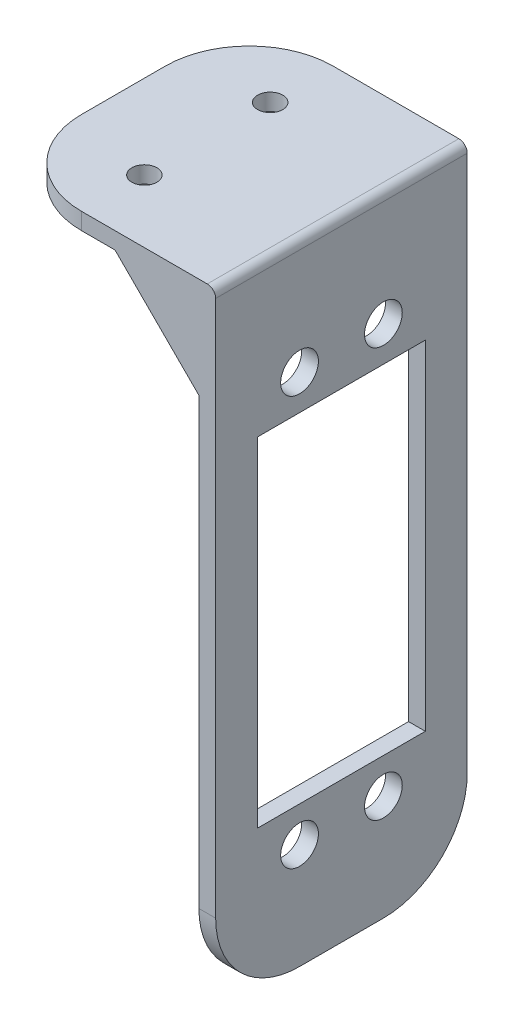
ISO-10303-21;
HEADER;
FILE_DESCRIPTION(('STEP AP214'),'2;1');
FILE_NAME('part.step','',(''),(''),'','','');
FILE_SCHEMA(('AUTOMOTIVE_DESIGN { 1 0 10303 214 1 1 1 1 }'));
ENDSEC;
DATA;
#1=APPLICATION_CONTEXT('core data for automotive mechanical design processes');
#2=APPLICATION_PROTOCOL_DEFINITION('international standard','automotive_design',2000,#1);
#3=PRODUCT_CONTEXT('',#1,'mechanical');
#4=PRODUCT('Part','Part','',(#3));
#5=PRODUCT_RELATED_PRODUCT_CATEGORY('part','',(#4));
#6=PRODUCT_DEFINITION_FORMATION('','',#4);
#7=PRODUCT_DEFINITION_CONTEXT('part definition',#1,'design');
#8=PRODUCT_DEFINITION('design','',#6,#7);
#9=PRODUCT_DEFINITION_SHAPE('','',#8);
#10=(LENGTH_UNIT() NAMED_UNIT(*) SI_UNIT(.MILLI.,.METRE.));
#11=(NAMED_UNIT(*) PLANE_ANGLE_UNIT() SI_UNIT($,.RADIAN.));
#12=(NAMED_UNIT(*) SI_UNIT($,.STERADIAN.) SOLID_ANGLE_UNIT());
#13=UNCERTAINTY_MEASURE_WITH_UNIT(LENGTH_MEASURE(1.E-05),#10,'distance_accuracy_value','');
#14=(GEOMETRIC_REPRESENTATION_CONTEXT(3) GLOBAL_UNCERTAINTY_ASSIGNED_CONTEXT((#13)) GLOBAL_UNIT_ASSIGNED_CONTEXT((#10,
#11,#12)) REPRESENTATION_CONTEXT('',''));
#15=CARTESIAN_POINT('',(0.,0.,0.));
#16=DIRECTION('',(0.,0.,1.));
#17=DIRECTION('',(1.,0.,0.));
#18=AXIS2_PLACEMENT_3D('',#15,#16,#17);
#19=CARTESIAN_POINT('',(23.,-1.,-30.));
#20=DIRECTION('',(0.,0.,1.));
#21=DIRECTION('',(1.,0.,0.));
#22=AXIS2_PLACEMENT_3D('',#19,#20,#21);
#23=CYLINDRICAL_SURFACE('',#22,1.);
#24=CARTESIAN_POINT('',(23.,-1.,-28.));
#25=DIRECTION('',(0.,0.,1.));
#26=DIRECTION('',(1.,0.,0.));
#27=AXIS2_PLACEMENT_3D('',#24,#25,#26);
#28=CIRCLE('',#27,1.);
#29=CARTESIAN_POINT('',(24.,-1.,-28.));
#30=VERTEX_POINT('',#29);
#31=CARTESIAN_POINT('',(23.,0.,-28.));
#32=VERTEX_POINT('',#31);
#33=EDGE_CURVE('E345',#30,#32,#28,.T.);
#34=ORIENTED_EDGE('',*,*,#33,.F.);
#35=DIRECTION('',(0.,0.,-1.));
#36=VECTOR('',#35,1.);
#37=CARTESIAN_POINT('',(24.,-1.,-30.));
#38=LINE('',#37,#36);
#39=CARTESIAN_POINT('',(24.,-1.,-2.));
#40=VERTEX_POINT('',#39);
#41=EDGE_CURVE('E351',#40,#30,#38,.T.);
#42=ORIENTED_EDGE('',*,*,#41,.F.);
#43=CARTESIAN_POINT('',(23.,-1.,-2.));
#44=DIRECTION('',(0.,0.,1.));
#45=DIRECTION('',(1.,0.,0.));
#46=AXIS2_PLACEMENT_3D('',#43,#44,#45);
#47=CIRCLE('',#46,1.);
#48=CARTESIAN_POINT('',(23.,0.,-2.));
#49=VERTEX_POINT('',#48);
#50=EDGE_CURVE('E361',#40,#49,#47,.T.);
#51=ORIENTED_EDGE('',*,*,#50,.T.);
#52=DIRECTION('',(0.,0.,-1.));
#53=VECTOR('',#52,1.);
#54=CARTESIAN_POINT('',(23.,0.,0.));
#55=LINE('',#54,#53);
#56=EDGE_CURVE('E474',#32,#49,#55,.F.);
#57=ORIENTED_EDGE('',*,*,#56,.F.);
#58=EDGE_LOOP('',(#34,#42,#51,#57));
#59=FACE_BOUND('',#58,.T.);
#60=ADVANCED_FACE('F191',(#59),#23,.F.);
#61=CARTESIAN_POINT('',(24.,-73.,-30.));
#62=DIRECTION('',(-1.,0.,0.));
#63=DIRECTION('',(0.,0.,1.));
#64=AXIS2_PLACEMENT_3D('',#61,#62,#63);
#65=PLANE('',#64);
#66=DIRECTION('',(0.,-1.,0.));
#67=VECTOR('',#66,1.);
#68=CARTESIAN_POINT('',(24.,0.,-25.));
#69=LINE('',#68,#67);
#70=CARTESIAN_POINT('',(24.,-15.8,-25.));
#71=VERTEX_POINT('',#70);
#72=CARTESIAN_POINT('',(24.,-56.2,-25.));
#73=VERTEX_POINT('',#72);
#74=EDGE_CURVE('E383',#71,#73,#69,.T.);
#75=ORIENTED_EDGE('',*,*,#74,.F.);
#76=DIRECTION('',(0.,0.,1.));
#77=VECTOR('',#76,1.);
#78=CARTESIAN_POINT('',(24.,-15.8,0.));
#79=LINE('',#78,#77);
#80=CARTESIAN_POINT('',(24.,-15.8,-5.));
#81=VERTEX_POINT('',#80);
#82=EDGE_CURVE('E380',#71,#81,#79,.T.);
#83=ORIENTED_EDGE('',*,*,#82,.T.);
#84=DIRECTION('',(0.,-1.,0.));
#85=VECTOR('',#84,1.);
#86=CARTESIAN_POINT('',(24.,0.,-5.));
#87=LINE('',#86,#85);
#88=CARTESIAN_POINT('',(24.,-56.2,-4.99999999999999));
#89=VERTEX_POINT('',#88);
#90=EDGE_CURVE('E375',#81,#89,#87,.T.);
#91=ORIENTED_EDGE('',*,*,#90,.T.);
#92=DIRECTION('',(0.,0.,-1.));
#93=VECTOR('',#92,1.);
#94=CARTESIAN_POINT('',(24.,-56.2,0.));
#95=LINE('',#94,#93);
#96=EDGE_CURVE('E386',#89,#73,#95,.T.);
#97=ORIENTED_EDGE('',*,*,#96,.T.);
#98=EDGE_LOOP('',(#75,#83,#91,#97));
#99=FACE_BOUND('',#98,.T.);
#100=CARTESIAN_POINT('',(24.,-60.4,-10.));
#101=DIRECTION('',(-1.,0.,0.));
#102=DIRECTION('',(0.,0.,1.));
#103=AXIS2_PLACEMENT_3D('',#100,#101,#102);
#104=CIRCLE('',#103,2.25);
#105=CARTESIAN_POINT('',(24.,-60.4,-7.75));
#106=VERTEX_POINT('',#105);
#107=EDGE_CURVE('E403',#106,#106,#104,.T.);
#108=ORIENTED_EDGE('',*,*,#107,.F.);
#109=EDGE_LOOP('',(#108));
#110=FACE_BOUND('',#109,.T.);
#111=CARTESIAN_POINT('',(24.,-11.6,-10.));
#112=DIRECTION('',(-1.,0.,0.));
#113=DIRECTION('',(0.,0.,1.));
#114=AXIS2_PLACEMENT_3D('',#111,#112,#113);
#115=CIRCLE('',#114,2.25000000000002);
#116=CARTESIAN_POINT('',(24.,-11.6,-7.74999999999999));
#117=VERTEX_POINT('',#116);
#118=EDGE_CURVE('E402',#117,#117,#115,.T.);
#119=ORIENTED_EDGE('',*,*,#118,.F.);
#120=EDGE_LOOP('',(#119));
#121=FACE_BOUND('',#120,.T.);
#122=CARTESIAN_POINT('',(24.,-11.6,-20.));
#123=DIRECTION('',(-1.,0.,0.));
#124=DIRECTION('',(0.,0.,1.));
#125=AXIS2_PLACEMENT_3D('',#122,#123,#124);
#126=CIRCLE('',#125,2.25);
#127=CARTESIAN_POINT('',(24.,-11.6,-17.75));
#128=VERTEX_POINT('',#127);
#129=EDGE_CURVE('E392',#128,#128,#126,.T.);
#130=ORIENTED_EDGE('',*,*,#129,.F.);
#131=EDGE_LOOP('',(#130));
#132=FACE_BOUND('',#131,.T.);
#133=CARTESIAN_POINT('',(24.,-60.4,-20.));
#134=DIRECTION('',(-1.,0.,0.));
#135=DIRECTION('',(0.,0.,1.));
#136=AXIS2_PLACEMENT_3D('',#133,#134,#135);
#137=CIRCLE('',#136,2.25);
#138=CARTESIAN_POINT('',(24.,-60.4,-17.75));
#139=VERTEX_POINT('',#138);
#140=EDGE_CURVE('E406',#139,#139,#137,.T.);
#141=ORIENTED_EDGE('',*,*,#140,.F.);
#142=EDGE_LOOP('',(#141));
#143=FACE_BOUND('',#142,.T.);
#144=DIRECTION('',(0.,-1.,0.));
#145=VECTOR('',#144,1.);
#146=CARTESIAN_POINT('',(24.,0.,-28.));
#147=LINE('',#146,#145);
#148=CARTESIAN_POINT('',(24.,-10.,-28.));
#149=VERTEX_POINT('',#148);
#150=EDGE_CURVE('E332',#30,#149,#147,.T.);
#151=ORIENTED_EDGE('',*,*,#150,.T.);
#152=DIRECTION('',(0.,0.,-1.));
#153=VECTOR('',#152,1.);
#154=CARTESIAN_POINT('',(24.,-10.,-28.));
#155=LINE('',#154,#153);
#156=CARTESIAN_POINT('',(24.,-10.,-30.));
#157=VERTEX_POINT('',#156);
#158=EDGE_CURVE('E340',#149,#157,#155,.T.);
#159=ORIENTED_EDGE('',*,*,#158,.T.);
#160=DIRECTION('',(0.,1.,0.));
#161=VECTOR('',#160,1.);
#162=CARTESIAN_POINT('',(24.,-73.,-30.));
#163=LINE('',#162,#161);
#164=CARTESIAN_POINT('',(24.,-63.,-30.));
#165=VERTEX_POINT('',#164);
#166=EDGE_CURVE('E438',#165,#157,#163,.T.);
#167=ORIENTED_EDGE('',*,*,#166,.F.);
#168=CARTESIAN_POINT('',(24.,-63.,-20.));
#169=DIRECTION('',(-1.,0.,0.));
#170=DIRECTION('',(0.,0.,1.));
#171=AXIS2_PLACEMENT_3D('',#168,#169,#170);
#172=CIRCLE('',#171,10.);
#173=CARTESIAN_POINT('',(24.,-73.,-20.));
#174=VERTEX_POINT('',#173);
#175=EDGE_CURVE('E495',#165,#174,#172,.T.);
#176=ORIENTED_EDGE('',*,*,#175,.T.);
#177=DIRECTION('',(0.,0.,1.));
#178=VECTOR('',#177,1.);
#179=CARTESIAN_POINT('',(24.,-73.,-30.));
#180=LINE('',#179,#178);
#181=CARTESIAN_POINT('',(24.,-73.,-10.));
#182=VERTEX_POINT('',#181);
#183=EDGE_CURVE('E432',#174,#182,#180,.T.);
#184=ORIENTED_EDGE('',*,*,#183,.T.);
#185=CARTESIAN_POINT('',(24.,-63.,-10.));
#186=DIRECTION('',(-1.,0.,0.));
#187=DIRECTION('',(0.,0.,1.));
#188=AXIS2_PLACEMENT_3D('',#185,#186,#187);
#189=CIRCLE('',#188,10.);
#190=CARTESIAN_POINT('',(24.,-63.,0.));
#191=VERTEX_POINT('',#190);
#192=EDGE_CURVE('E493',#182,#191,#189,.T.);
#193=ORIENTED_EDGE('',*,*,#192,.T.);
#194=DIRECTION('',(0.,1.,0.));
#195=VECTOR('',#194,1.);
#196=CARTESIAN_POINT('',(24.,-73.,0.));
#197=LINE('',#196,#195);
#198=CARTESIAN_POINT('',(24.,-10.,0.));
#199=VERTEX_POINT('',#198);
#200=EDGE_CURVE('E444',#191,#199,#197,.T.);
#201=ORIENTED_EDGE('',*,*,#200,.T.);
#202=DIRECTION('',(0.,0.,1.));
#203=VECTOR('',#202,1.);
#204=CARTESIAN_POINT('',(24.,-10.,-2.));
#205=LINE('',#204,#203);
#206=CARTESIAN_POINT('',(24.,-10.,-2.));
#207=VERTEX_POINT('',#206);
#208=EDGE_CURVE('E373',#207,#199,#205,.T.);
#209=ORIENTED_EDGE('',*,*,#208,.F.);
#210=DIRECTION('',(0.,-1.,0.));
#211=VECTOR('',#210,1.);
#212=CARTESIAN_POINT('',(24.,0.,-2.));
#213=LINE('',#212,#211);
#214=EDGE_CURVE('E359',#40,#207,#213,.T.);
#215=ORIENTED_EDGE('',*,*,#214,.F.);
#216=ORIENTED_EDGE('',*,*,#41,.T.);
#217=EDGE_LOOP('',(#151,#159,#167,#176,#184,#193,#201,#209,#215,#216));
#218=FACE_BOUND('',#217,.T.);
#219=ADVANCED_FACE('F348',(#99,#110,#121,#132,#143,#218),#65,.T.);
#220=CARTESIAN_POINT('',(0.,0.,0.));
#221=DIRECTION('',(0.,-1.,0.));
#222=DIRECTION('',(0.,0.,-1.));
#223=AXIS2_PLACEMENT_3D('',#220,#221,#222);
#224=PLANE('',#223);
#225=CARTESIAN_POINT('',(10.,0.,-7.5));
#226=DIRECTION('',(0.,1.,0.));
#227=DIRECTION('',(0.,0.,1.));
#228=AXIS2_PLACEMENT_3D('',#225,#226,#227);
#229=CIRCLE('',#228,1.5);
#230=CARTESIAN_POINT('',(10.,0.,-6.));
#231=VERTEX_POINT('',#230);
#232=EDGE_CURVE('E451',#231,#231,#229,.T.);
#233=ORIENTED_EDGE('',*,*,#232,.T.);
#234=EDGE_LOOP('',(#233));
#235=FACE_BOUND('',#234,.T.);
#236=CARTESIAN_POINT('',(10.,0.,-22.5));
#237=DIRECTION('',(0.,1.,0.));
#238=DIRECTION('',(0.,0.,1.));
#239=AXIS2_PLACEMENT_3D('',#236,#237,#238);
#240=CIRCLE('',#239,1.5);
#241=CARTESIAN_POINT('',(10.,0.,-21.));
#242=VERTEX_POINT('',#241);
#243=EDGE_CURVE('E441',#242,#242,#240,.T.);
#244=ORIENTED_EDGE('',*,*,#243,.T.);
#245=EDGE_LOOP('',(#244));
#246=FACE_BOUND('',#245,.T.);
#247=DIRECTION('',(-1.,0.,0.));
#248=VECTOR('',#247,1.);
#249=CARTESIAN_POINT('',(0.,0.,-30.));
#250=LINE('',#249,#248);
#251=CARTESIAN_POINT('',(14.,0.,-30.));
#252=VERTEX_POINT('',#251);
#253=CARTESIAN_POINT('',(10.,0.,-30.));
#254=VERTEX_POINT('',#253);
#255=EDGE_CURVE('E463',#252,#254,#250,.T.);
#256=ORIENTED_EDGE('',*,*,#255,.F.);
#257=DIRECTION('',(0.,0.,-1.));
#258=VECTOR('',#257,1.);
#259=CARTESIAN_POINT('',(14.,0.,-28.));
#260=LINE('',#259,#258);
#261=CARTESIAN_POINT('',(14.,0.,-28.));
#262=VERTEX_POINT('',#261);
#263=EDGE_CURVE('E344',#262,#252,#260,.T.);
#264=ORIENTED_EDGE('',*,*,#263,.F.);
#265=DIRECTION('',(1.,0.,0.));
#266=VECTOR('',#265,1.);
#267=CARTESIAN_POINT('',(0.,0.,-28.));
#268=LINE('',#267,#266);
#269=EDGE_CURVE('E335',#262,#32,#268,.T.);
#270=ORIENTED_EDGE('',*,*,#269,.T.);
#271=ORIENTED_EDGE('',*,*,#56,.T.);
#272=DIRECTION('',(1.,0.,0.));
#273=VECTOR('',#272,1.);
#274=CARTESIAN_POINT('',(0.,0.,-2.));
#275=LINE('',#274,#273);
#276=CARTESIAN_POINT('',(14.,0.,-2.));
#277=VERTEX_POINT('',#276);
#278=EDGE_CURVE('E364',#277,#49,#275,.T.);
#279=ORIENTED_EDGE('',*,*,#278,.F.);
#280=DIRECTION('',(0.,0.,1.));
#281=VECTOR('',#280,1.);
#282=CARTESIAN_POINT('',(14.,0.,-2.));
#283=LINE('',#282,#281);
#284=CARTESIAN_POINT('',(14.,0.,0.));
#285=VERTEX_POINT('',#284);
#286=EDGE_CURVE('E370',#277,#285,#283,.T.);
#287=ORIENTED_EDGE('',*,*,#286,.T.);
#288=DIRECTION('',(1.,0.,0.));
#289=VECTOR('',#288,1.);
#290=CARTESIAN_POINT('',(0.,0.,0.));
#291=LINE('',#290,#289);
#292=CARTESIAN_POINT('',(10.,0.,0.));
#293=VERTEX_POINT('',#292);
#294=EDGE_CURVE('E469',#293,#285,#291,.T.);
#295=ORIENTED_EDGE('',*,*,#294,.F.);
#296=CARTESIAN_POINT('',(10.,0.,-10.));
#297=DIRECTION('',(0.,-1.,0.));
#298=DIRECTION('',(0.,0.,-1.));
#299=AXIS2_PLACEMENT_3D('',#296,#297,#298);
#300=CIRCLE('',#299,10.);
#301=CARTESIAN_POINT('',(0.,0.,-10.));
#302=VERTEX_POINT('',#301);
#303=EDGE_CURVE('E514',#293,#302,#300,.T.);
#304=ORIENTED_EDGE('',*,*,#303,.T.);
#305=DIRECTION('',(0.,0.,1.));
#306=VECTOR('',#305,1.);
#307=CARTESIAN_POINT('',(0.,0.,0.));
#308=LINE('',#307,#306);
#309=CARTESIAN_POINT('',(0.,0.,-20.));
#310=VERTEX_POINT('',#309);
#311=EDGE_CURVE('E457',#310,#302,#308,.T.);
#312=ORIENTED_EDGE('',*,*,#311,.F.);
#313=CARTESIAN_POINT('',(10.,0.,-20.));
#314=DIRECTION('',(0.,-1.,0.));
#315=DIRECTION('',(0.,0.,-1.));
#316=AXIS2_PLACEMENT_3D('',#313,#314,#315);
#317=CIRCLE('',#316,10.);
#318=EDGE_CURVE('E511',#310,#254,#317,.T.);
#319=ORIENTED_EDGE('',*,*,#318,.T.);
#320=EDGE_LOOP('',(#256,#264,#270,#271,#279,#287,#295,#304,#312,#319));
#321=FACE_BOUND('',#320,.T.);
#322=ADVANCED_FACE('F532',(#235,#246,#321),#224,.T.);
#323=CARTESIAN_POINT('',(26.,-73.,-30.));
#324=DIRECTION('',(1.,0.,0.));
#325=DIRECTION('',(0.,0.,-1.));
#326=AXIS2_PLACEMENT_3D('',#323,#324,#325);
#327=PLANE('',#326);
#328=DIRECTION('',(0.,1.,0.));
#329=VECTOR('',#328,1.);
#330=CARTESIAN_POINT('',(26.,-73.,-25.));
#331=LINE('',#330,#329);
#332=CARTESIAN_POINT('',(26.,-56.2,-25.));
#333=VERTEX_POINT('',#332);
#334=CARTESIAN_POINT('',(26.,-15.8,-25.));
#335=VERTEX_POINT('',#334);
#336=EDGE_CURVE('E424',#333,#335,#331,.T.);
#337=ORIENTED_EDGE('',*,*,#336,.F.);
#338=DIRECTION('',(0.,0.,-1.));
#339=VECTOR('',#338,1.);
#340=CARTESIAN_POINT('',(26.,-56.2,-30.));
#341=LINE('',#340,#339);
#342=CARTESIAN_POINT('',(26.,-56.2,-4.99999999999999));
#343=VERTEX_POINT('',#342);
#344=EDGE_CURVE('E417',#343,#333,#341,.T.);
#345=ORIENTED_EDGE('',*,*,#344,.F.);
#346=DIRECTION('',(0.,1.,0.));
#347=VECTOR('',#346,1.);
#348=CARTESIAN_POINT('',(26.,-73.,-4.99999999999999));
#349=LINE('',#348,#347);
#350=CARTESIAN_POINT('',(26.,-15.8,-5.));
#351=VERTEX_POINT('',#350);
#352=EDGE_CURVE('E419',#343,#351,#349,.T.);
#353=ORIENTED_EDGE('',*,*,#352,.T.);
#354=DIRECTION('',(0.,0.,1.));
#355=VECTOR('',#354,1.);
#356=CARTESIAN_POINT('',(26.,-15.8,-30.));
#357=LINE('',#356,#355);
#358=EDGE_CURVE('E422',#335,#351,#357,.T.);
#359=ORIENTED_EDGE('',*,*,#358,.F.);
#360=EDGE_LOOP('',(#337,#345,#353,#359));
#361=FACE_BOUND('',#360,.T.);
#362=CARTESIAN_POINT('',(26.,-60.4,-10.));
#363=DIRECTION('',(1.,0.,0.));
#364=DIRECTION('',(0.,0.,-1.));
#365=AXIS2_PLACEMENT_3D('',#362,#363,#364);
#366=CIRCLE('',#365,2.25);
#367=CARTESIAN_POINT('',(26.,-60.4,-12.25));
#368=VERTEX_POINT('',#367);
#369=EDGE_CURVE('E429',#368,#368,#366,.T.);
#370=ORIENTED_EDGE('',*,*,#369,.F.);
#371=EDGE_LOOP('',(#370));
#372=FACE_BOUND('',#371,.T.);
#373=CARTESIAN_POINT('',(26.,-11.6,-10.));
#374=DIRECTION('',(1.,0.,0.));
#375=DIRECTION('',(0.,0.,-1.));
#376=AXIS2_PLACEMENT_3D('',#373,#374,#375);
#377=CIRCLE('',#376,2.25000000000002);
#378=CARTESIAN_POINT('',(26.,-11.6,-12.25));
#379=VERTEX_POINT('',#378);
#380=EDGE_CURVE('E426',#379,#379,#377,.T.);
#381=ORIENTED_EDGE('',*,*,#380,.F.);
#382=EDGE_LOOP('',(#381));
#383=FACE_BOUND('',#382,.T.);
#384=CARTESIAN_POINT('',(26.,-11.6,-20.));
#385=DIRECTION('',(1.,0.,0.));
#386=DIRECTION('',(0.,0.,-1.));
#387=AXIS2_PLACEMENT_3D('',#384,#385,#386);
#388=CIRCLE('',#387,2.25);
#389=CARTESIAN_POINT('',(26.,-11.6,-22.25));
#390=VERTEX_POINT('',#389);
#391=EDGE_CURVE('E414',#390,#390,#388,.T.);
#392=ORIENTED_EDGE('',*,*,#391,.F.);
#393=EDGE_LOOP('',(#392));
#394=FACE_BOUND('',#393,.T.);
#395=CARTESIAN_POINT('',(26.,-60.4,-20.));
#396=DIRECTION('',(1.,0.,0.));
#397=DIRECTION('',(0.,0.,-1.));
#398=AXIS2_PLACEMENT_3D('',#395,#396,#397);
#399=CIRCLE('',#398,2.25);
#400=CARTESIAN_POINT('',(26.,-60.4,-22.25));
#401=VERTEX_POINT('',#400);
#402=EDGE_CURVE('E411',#401,#401,#399,.T.);
#403=ORIENTED_EDGE('',*,*,#402,.F.);
#404=EDGE_LOOP('',(#403));
#405=FACE_BOUND('',#404,.T.);
#406=DIRECTION('',(0.,0.,-1.));
#407=VECTOR('',#406,1.);
#408=CARTESIAN_POINT('',(26.,-73.,-30.));
#409=LINE('',#408,#407);
#410=CARTESIAN_POINT('',(26.,-73.,-10.));
#411=VERTEX_POINT('',#410);
#412=CARTESIAN_POINT('',(26.,-73.,-20.));
#413=VERTEX_POINT('',#412);
#414=EDGE_CURVE('E435',#411,#413,#409,.T.);
#415=ORIENTED_EDGE('',*,*,#414,.T.);
#416=CARTESIAN_POINT('',(26.,-63.,-20.));
#417=DIRECTION('',(1.,0.,0.));
#418=DIRECTION('',(0.,0.,-1.));
#419=AXIS2_PLACEMENT_3D('',#416,#417,#418);
#420=CIRCLE('',#419,10.);
#421=CARTESIAN_POINT('',(26.,-63.,-30.));
#422=VERTEX_POINT('',#421);
#423=EDGE_CURVE('E503',#413,#422,#420,.T.);
#424=ORIENTED_EDGE('',*,*,#423,.T.);
#425=DIRECTION('',(0.,1.,0.));
#426=VECTOR('',#425,1.);
#427=CARTESIAN_POINT('',(26.,-73.,-30.));
#428=LINE('',#427,#426);
#429=CARTESIAN_POINT('',(26.,1.,-30.));
#430=VERTEX_POINT('',#429);
#431=EDGE_CURVE('E439',#422,#430,#428,.T.);
#432=ORIENTED_EDGE('',*,*,#431,.T.);
#433=DIRECTION('',(0.,0.,-1.));
#434=VECTOR('',#433,1.);
#435=CARTESIAN_POINT('',(26.,1.,0.));
#436=LINE('',#435,#434);
#437=CARTESIAN_POINT('',(26.,1.,0.));
#438=VERTEX_POINT('',#437);
#439=EDGE_CURVE('E482',#430,#438,#436,.F.);
#440=ORIENTED_EDGE('',*,*,#439,.T.);
#441=DIRECTION('',(0.,1.,0.));
#442=VECTOR('',#441,1.);
#443=CARTESIAN_POINT('',(26.,-73.,0.));
#444=LINE('',#443,#442);
#445=CARTESIAN_POINT('',(26.,-63.,0.));
#446=VERTEX_POINT('',#445);
#447=EDGE_CURVE('E442',#446,#438,#444,.T.);
#448=ORIENTED_EDGE('',*,*,#447,.F.);
#449=CARTESIAN_POINT('',(26.,-63.,-10.));
#450=DIRECTION('',(1.,0.,0.));
#451=DIRECTION('',(0.,0.,-1.));
#452=AXIS2_PLACEMENT_3D('',#449,#450,#451);
#453=CIRCLE('',#452,10.);
#454=EDGE_CURVE('E501',#446,#411,#453,.T.);
#455=ORIENTED_EDGE('',*,*,#454,.T.);
#456=EDGE_LOOP('',(#415,#424,#432,#440,#448,#455));
#457=FACE_BOUND('',#456,.T.);
#458=ADVANCED_FACE('F550',(#361,#372,#383,#394,#405,#457),#327,.T.);
#459=CARTESIAN_POINT('',(0.,2.,0.));
#460=DIRECTION('',(0.,-1.,0.));
#461=DIRECTION('',(0.,0.,-1.));
#462=AXIS2_PLACEMENT_3D('',#459,#460,#461);
#463=PLANE('',#462);
#464=DIRECTION('',(0.,0.,1.));
#465=VECTOR('',#464,1.);
#466=CARTESIAN_POINT('',(0.,2.,0.));
#467=LINE('',#466,#465);
#468=CARTESIAN_POINT('',(0.,2.,-20.));
#469=VERTEX_POINT('',#468);
#470=CARTESIAN_POINT('',(0.,2.,-10.));
#471=VERTEX_POINT('',#470);
#472=EDGE_CURVE('E460',#469,#471,#467,.T.);
#473=ORIENTED_EDGE('',*,*,#472,.T.);
#474=CARTESIAN_POINT('',(10.,2.,-10.));
#475=DIRECTION('',(0.,-1.,0.));
#476=DIRECTION('',(0.,0.,-1.));
#477=AXIS2_PLACEMENT_3D('',#474,#475,#476);
#478=CIRCLE('',#477,10.);
#479=CARTESIAN_POINT('',(10.,2.,0.));
#480=VERTEX_POINT('',#479);
#481=EDGE_CURVE('E12',#471,#480,#478,.F.);
#482=ORIENTED_EDGE('',*,*,#481,.T.);
#483=DIRECTION('',(1.,0.,0.));
#484=VECTOR('',#483,1.);
#485=CARTESIAN_POINT('',(0.,2.,0.));
#486=LINE('',#485,#484);
#487=CARTESIAN_POINT('',(25.,2.,0.));
#488=VERTEX_POINT('',#487);
#489=EDGE_CURVE('E462',#480,#488,#486,.T.);
#490=ORIENTED_EDGE('',*,*,#489,.T.);
#491=DIRECTION('',(0.,0.,-1.));
#492=VECTOR('',#491,1.);
#493=CARTESIAN_POINT('',(25.,2.,-30.));
#494=LINE('',#493,#492);
#495=CARTESIAN_POINT('',(25.,2.,-30.));
#496=VERTEX_POINT('',#495);
#497=EDGE_CURVE('E476',#488,#496,#494,.T.);
#498=ORIENTED_EDGE('',*,*,#497,.T.);
#499=DIRECTION('',(-1.,0.,0.));
#500=VECTOR('',#499,1.);
#501=CARTESIAN_POINT('',(0.,2.,-30.));
#502=LINE('',#501,#500);
#503=CARTESIAN_POINT('',(10.,2.,-30.));
#504=VERTEX_POINT('',#503);
#505=EDGE_CURVE('E465',#496,#504,#502,.T.);
#506=ORIENTED_EDGE('',*,*,#505,.T.);
#507=CARTESIAN_POINT('',(10.,2.,-20.));
#508=DIRECTION('',(0.,-1.,0.));
#509=DIRECTION('',(0.,0.,-1.));
#510=AXIS2_PLACEMENT_3D('',#507,#508,#509);
#511=CIRCLE('',#510,10.);
#512=EDGE_CURVE('E199',#504,#469,#511,.F.);
#513=ORIENTED_EDGE('',*,*,#512,.T.);
#514=EDGE_LOOP('',(#473,#482,#490,#498,#506,#513));
#515=FACE_BOUND('',#514,.T.);
#516=CARTESIAN_POINT('',(10.,2.,-7.5));
#517=DIRECTION('',(0.,1.,0.));
#518=DIRECTION('',(0.,0.,1.));
#519=AXIS2_PLACEMENT_3D('',#516,#517,#518);
#520=CIRCLE('',#519,1.5);
#521=CARTESIAN_POINT('',(10.,2.,-6.));
#522=VERTEX_POINT('',#521);
#523=EDGE_CURVE('E454',#522,#522,#520,.T.);
#524=ORIENTED_EDGE('',*,*,#523,.F.);
#525=EDGE_LOOP('',(#524));
#526=FACE_BOUND('',#525,.T.);
#527=CARTESIAN_POINT('',(10.,2.,-22.5));
#528=DIRECTION('',(0.,1.,0.));
#529=DIRECTION('',(0.,0.,1.));
#530=AXIS2_PLACEMENT_3D('',#527,#528,#529);
#531=CIRCLE('',#530,1.5);
#532=CARTESIAN_POINT('',(10.,2.,-21.));
#533=VERTEX_POINT('',#532);
#534=EDGE_CURVE('E448',#533,#533,#531,.T.);
#535=ORIENTED_EDGE('',*,*,#534,.F.);
#536=EDGE_LOOP('',(#535));
#537=FACE_BOUND('',#536,.T.);
#538=ADVANCED_FACE('F521',(#515,#526,#537),#463,.F.);
#539=CARTESIAN_POINT('',(0.,2.,0.));
#540=DIRECTION('',(1.,0.,0.));
#541=DIRECTION('',(0.,0.,-1.));
#542=AXIS2_PLACEMENT_3D('',#539,#540,#541);
#543=PLANE('',#542);
#544=ORIENTED_EDGE('',*,*,#311,.T.);
#545=DIRECTION('',(0.,-1.,0.));
#546=VECTOR('',#545,1.);
#547=CARTESIAN_POINT('',(0.,2.,-10.));
#548=LINE('',#547,#546);
#549=EDGE_CURVE('E214',#302,#471,#548,.F.);
#550=ORIENTED_EDGE('',*,*,#549,.T.);
#551=ORIENTED_EDGE('',*,*,#472,.F.);
#552=DIRECTION('',(0.,-1.,0.));
#553=VECTOR('',#552,1.);
#554=CARTESIAN_POINT('',(0.,2.,-20.));
#555=LINE('',#554,#553);
#556=EDGE_CURVE('E516',#469,#310,#555,.T.);
#557=ORIENTED_EDGE('',*,*,#556,.T.);
#558=EDGE_LOOP('',(#544,#550,#551,#557));
#559=FACE_BOUND('',#558,.T.);
#560=ADVANCED_FACE('F528',(#559),#543,.F.);
#561=CARTESIAN_POINT('',(0.,2.,0.));
#562=DIRECTION('',(0.,0.,-1.));
#563=DIRECTION('',(-1.,0.,0.));
#564=AXIS2_PLACEMENT_3D('',#561,#562,#563);
#565=PLANE('',#564);
#566=DIRECTION('',(0.707106781186548,-0.707106781186548,0.));
#567=VECTOR('',#566,1.);
#568=CARTESIAN_POINT('',(7.,7.,0.));
#569=LINE('',#568,#567);
#570=EDGE_CURVE('E357',#285,#199,#569,.T.);
#571=ORIENTED_EDGE('',*,*,#570,.T.);
#572=ORIENTED_EDGE('',*,*,#200,.F.);
#573=DIRECTION('',(1.,0.,0.));
#574=VECTOR('',#573,1.);
#575=CARTESIAN_POINT('',(26.,-63.,0.));
#576=LINE('',#575,#574);
#577=EDGE_CURVE('E508',#191,#446,#576,.T.);
#578=ORIENTED_EDGE('',*,*,#577,.T.);
#579=ORIENTED_EDGE('',*,*,#447,.T.);
#580=CARTESIAN_POINT('',(25.,1.,0.));
#581=DIRECTION('',(0.,0.,-1.));
#582=DIRECTION('',(-1.,0.,0.));
#583=AXIS2_PLACEMENT_3D('',#580,#581,#582);
#584=CIRCLE('',#583,1.);
#585=EDGE_CURVE('E485',#438,#488,#584,.F.);
#586=ORIENTED_EDGE('',*,*,#585,.T.);
#587=ORIENTED_EDGE('',*,*,#489,.F.);
#588=DIRECTION('',(0.,-1.,0.));
#589=VECTOR('',#588,1.);
#590=CARTESIAN_POINT('',(10.,2.,0.));
#591=LINE('',#590,#589);
#592=EDGE_CURVE('E505',#480,#293,#591,.T.);
#593=ORIENTED_EDGE('',*,*,#592,.T.);
#594=ORIENTED_EDGE('',*,*,#294,.T.);
#595=EDGE_LOOP('',(#571,#572,#578,#579,#586,#587,#593,#594));
#596=FACE_BOUND('',#595,.T.);
#597=ADVANCED_FACE('F539',(#596),#565,.F.);
#598=CARTESIAN_POINT('',(0.,2.,-30.));
#599=DIRECTION('',(0.,0.,1.));
#600=DIRECTION('',(1.,0.,0.));
#601=AXIS2_PLACEMENT_3D('',#598,#599,#600);
#602=PLANE('',#601);
#603=ORIENTED_EDGE('',*,*,#166,.T.);
#604=DIRECTION('',(0.707106781186548,-0.707106781186548,0.));
#605=VECTOR('',#604,1.);
#606=CARTESIAN_POINT('',(7.,7.,-30.));
#607=LINE('',#606,#605);
#608=EDGE_CURVE('E206',#252,#157,#607,.T.);
#609=ORIENTED_EDGE('',*,*,#608,.F.);
#610=ORIENTED_EDGE('',*,*,#255,.T.);
#611=DIRECTION('',(0.,-1.,0.));
#612=VECTOR('',#611,1.);
#613=CARTESIAN_POINT('',(10.,2.,-30.));
#614=LINE('',#613,#612);
#615=EDGE_CURVE('E488',#254,#504,#614,.F.);
#616=ORIENTED_EDGE('',*,*,#615,.T.);
#617=ORIENTED_EDGE('',*,*,#505,.F.);
#618=CARTESIAN_POINT('',(25.,1.,-30.));
#619=DIRECTION('',(0.,0.,1.));
#620=DIRECTION('',(1.,0.,0.));
#621=AXIS2_PLACEMENT_3D('',#618,#619,#620);
#622=CIRCLE('',#621,1.);
#623=EDGE_CURVE('E479',#496,#430,#622,.F.);
#624=ORIENTED_EDGE('',*,*,#623,.T.);
#625=ORIENTED_EDGE('',*,*,#431,.F.);
#626=DIRECTION('',(-1.,0.,0.));
#627=VECTOR('',#626,1.);
#628=CARTESIAN_POINT('',(24.,-63.,-30.));
#629=LINE('',#628,#627);
#630=EDGE_CURVE('E490',#422,#165,#629,.T.);
#631=ORIENTED_EDGE('',*,*,#630,.T.);
#632=EDGE_LOOP('',(#603,#609,#610,#616,#617,#624,#625,#631));
#633=FACE_BOUND('',#632,.T.);
#634=ADVANCED_FACE('F546',(#633),#602,.F.);
#635=CARTESIAN_POINT('',(10.,2.,-7.5));
#636=DIRECTION('',(0.,-1.,0.));
#637=DIRECTION('',(0.,0.,-1.));
#638=AXIS2_PLACEMENT_3D('',#635,#636,#637);
#639=CYLINDRICAL_SURFACE('',#638,1.5);
#640=ORIENTED_EDGE('',*,*,#523,.T.);
#641=EDGE_LOOP('',(#640));
#642=FACE_BOUND('',#641,.T.);
#643=ORIENTED_EDGE('',*,*,#232,.F.);
#644=EDGE_LOOP('',(#643));
#645=FACE_BOUND('',#644,.T.);
#646=ADVANCED_FACE('F646',(#642,#645),#639,.F.);
#647=CARTESIAN_POINT('',(10.,2.,-22.5));
#648=DIRECTION('',(0.,-1.,0.));
#649=DIRECTION('',(0.,0.,-1.));
#650=AXIS2_PLACEMENT_3D('',#647,#648,#649);
#651=CYLINDRICAL_SURFACE('',#650,1.5);
#652=ORIENTED_EDGE('',*,*,#534,.T.);
#653=EDGE_LOOP('',(#652));
#654=FACE_BOUND('',#653,.T.);
#655=ORIENTED_EDGE('',*,*,#243,.F.);
#656=EDGE_LOOP('',(#655));
#657=FACE_BOUND('',#656,.T.);
#658=ADVANCED_FACE('F640',(#654,#657),#651,.F.);
#659=CARTESIAN_POINT('',(0.,-73.,0.));
#660=DIRECTION('',(0.,-1.,0.));
#661=DIRECTION('',(0.,0.,-1.));
#662=AXIS2_PLACEMENT_3D('',#659,#660,#661);
#663=PLANE('',#662);
#664=ORIENTED_EDGE('',*,*,#183,.F.);
#665=DIRECTION('',(-1.,0.,0.));
#666=VECTOR('',#665,1.);
#667=CARTESIAN_POINT('',(26.,-73.,-20.));
#668=LINE('',#667,#666);
#669=EDGE_CURVE('E499',#174,#413,#668,.F.);
#670=ORIENTED_EDGE('',*,*,#669,.T.);
#671=ORIENTED_EDGE('',*,*,#414,.F.);
#672=DIRECTION('',(1.,0.,0.));
#673=VECTOR('',#672,1.);
#674=CARTESIAN_POINT('',(24.,-73.,-10.));
#675=LINE('',#674,#673);
#676=EDGE_CURVE('E497',#411,#182,#675,.F.);
#677=ORIENTED_EDGE('',*,*,#676,.T.);
#678=EDGE_LOOP('',(#664,#670,#671,#677));
#679=FACE_BOUND('',#678,.T.);
#680=ADVANCED_FACE('F559',(#679),#663,.T.);
#681=CARTESIAN_POINT('',(25.,1.,0.));
#682=DIRECTION('',(0.,0.,1.));
#683=DIRECTION('',(1.,0.,0.));
#684=AXIS2_PLACEMENT_3D('',#681,#682,#683);
#685=CYLINDRICAL_SURFACE('',#684,1.);
#686=ORIENTED_EDGE('',*,*,#585,.F.);
#687=ORIENTED_EDGE('',*,*,#439,.F.);
#688=ORIENTED_EDGE('',*,*,#623,.F.);
#689=ORIENTED_EDGE('',*,*,#497,.F.);
#690=EDGE_LOOP('',(#686,#687,#688,#689));
#691=FACE_BOUND('',#690,.T.);
#692=ADVANCED_FACE('F545',(#691),#685,.T.);
#693=CARTESIAN_POINT('',(99.,-60.4,-20.));
#694=DIRECTION('',(-1.,0.,0.));
#695=DIRECTION('',(0.,0.,1.));
#696=AXIS2_PLACEMENT_3D('',#693,#694,#695);
#697=CYLINDRICAL_SURFACE('',#696,2.25);
#698=ORIENTED_EDGE('',*,*,#402,.T.);
#699=EDGE_LOOP('',(#698));
#700=FACE_BOUND('',#699,.T.);
#701=ORIENTED_EDGE('',*,*,#140,.T.);
#702=EDGE_LOOP('',(#701));
#703=FACE_BOUND('',#702,.T.);
#704=ADVANCED_FACE('F587',(#700,#703),#697,.F.);
#705=CARTESIAN_POINT('',(99.,-11.6,-20.));
#706=DIRECTION('',(-1.,0.,0.));
#707=DIRECTION('',(0.,0.,1.));
#708=AXIS2_PLACEMENT_3D('',#705,#706,#707);
#709=CYLINDRICAL_SURFACE('',#708,2.25);
#710=ORIENTED_EDGE('',*,*,#391,.T.);
#711=EDGE_LOOP('',(#710));
#712=FACE_BOUND('',#711,.T.);
#713=ORIENTED_EDGE('',*,*,#129,.T.);
#714=EDGE_LOOP('',(#713));
#715=FACE_BOUND('',#714,.T.);
#716=ADVANCED_FACE('F612',(#712,#715),#709,.F.);
#717=CARTESIAN_POINT('',(99.,-56.2,0.));
#718=DIRECTION('',(0.,1.,0.));
#719=DIRECTION('',(0.,0.,1.));
#720=AXIS2_PLACEMENT_3D('',#717,#718,#719);
#721=PLANE('',#720);
#722=DIRECTION('',(-1.,0.,0.));
#723=VECTOR('',#722,1.);
#724=CARTESIAN_POINT('',(99.,-56.2,-25.));
#725=LINE('',#724,#723);
#726=EDGE_CURVE('E390',#333,#73,#725,.T.);
#727=ORIENTED_EDGE('',*,*,#726,.T.);
#728=ORIENTED_EDGE('',*,*,#96,.F.);
#729=DIRECTION('',(-1.,0.,0.));
#730=VECTOR('',#729,1.);
#731=CARTESIAN_POINT('',(99.,-56.2,-5.));
#732=LINE('',#731,#730);
#733=EDGE_CURVE('E389',#343,#89,#732,.T.);
#734=ORIENTED_EDGE('',*,*,#733,.F.);
#735=ORIENTED_EDGE('',*,*,#344,.T.);
#736=EDGE_LOOP('',(#727,#728,#734,#735));
#737=FACE_BOUND('',#736,.T.);
#738=ADVANCED_FACE('F608',(#737),#721,.T.);
#739=CARTESIAN_POINT('',(99.,0.,-25.));
#740=DIRECTION('',(0.,0.,-1.));
#741=DIRECTION('',(0.,1.,0.));
#742=AXIS2_PLACEMENT_3D('',#739,#740,#741);
#743=PLANE('',#742);
#744=ORIENTED_EDGE('',*,*,#336,.T.);
#745=DIRECTION('',(-1.,0.,0.));
#746=VECTOR('',#745,1.);
#747=CARTESIAN_POINT('',(99.,-15.8,-25.));
#748=LINE('',#747,#746);
#749=EDGE_CURVE('E393',#335,#71,#748,.T.);
#750=ORIENTED_EDGE('',*,*,#749,.T.);
#751=ORIENTED_EDGE('',*,*,#74,.T.);
#752=ORIENTED_EDGE('',*,*,#726,.F.);
#753=EDGE_LOOP('',(#744,#750,#751,#752));
#754=FACE_BOUND('',#753,.T.);
#755=ADVANCED_FACE('F611',(#754),#743,.F.);
#756=CARTESIAN_POINT('',(99.,-15.8,0.));
#757=DIRECTION('',(0.,1.,0.));
#758=DIRECTION('',(0.,0.,1.));
#759=AXIS2_PLACEMENT_3D('',#756,#757,#758);
#760=PLANE('',#759);
#761=ORIENTED_EDGE('',*,*,#358,.T.);
#762=DIRECTION('',(-1.,0.,0.));
#763=VECTOR('',#762,1.);
#764=CARTESIAN_POINT('',(99.,-15.8,-5.00000000000001));
#765=LINE('',#764,#763);
#766=EDGE_CURVE('E396',#351,#81,#765,.T.);
#767=ORIENTED_EDGE('',*,*,#766,.T.);
#768=ORIENTED_EDGE('',*,*,#82,.F.);
#769=ORIENTED_EDGE('',*,*,#749,.F.);
#770=EDGE_LOOP('',(#761,#767,#768,#769));
#771=FACE_BOUND('',#770,.T.);
#772=ADVANCED_FACE('F616',(#771),#760,.F.);
#773=CARTESIAN_POINT('',(99.,0.,-5.00000000000001));
#774=DIRECTION('',(0.,0.,-1.));
#775=DIRECTION('',(0.,1.,0.));
#776=AXIS2_PLACEMENT_3D('',#773,#774,#775);
#777=PLANE('',#776);
#778=ORIENTED_EDGE('',*,*,#733,.T.);
#779=ORIENTED_EDGE('',*,*,#90,.F.);
#780=ORIENTED_EDGE('',*,*,#766,.F.);
#781=ORIENTED_EDGE('',*,*,#352,.F.);
#782=EDGE_LOOP('',(#778,#779,#780,#781));
#783=FACE_BOUND('',#782,.T.);
#784=ADVANCED_FACE('F620',(#783),#777,.T.);
#785=CARTESIAN_POINT('',(99.,-11.6,-10.));
#786=DIRECTION('',(-1.,0.,0.));
#787=DIRECTION('',(0.,0.,1.));
#788=AXIS2_PLACEMENT_3D('',#785,#786,#787);
#789=CYLINDRICAL_SURFACE('',#788,2.25000000000002);
#790=ORIENTED_EDGE('',*,*,#380,.T.);
#791=EDGE_LOOP('',(#790));
#792=FACE_BOUND('',#791,.T.);
#793=ORIENTED_EDGE('',*,*,#118,.T.);
#794=EDGE_LOOP('',(#793));
#795=FACE_BOUND('',#794,.T.);
#796=ADVANCED_FACE('F624',(#792,#795),#789,.F.);
#797=CARTESIAN_POINT('',(99.,-60.4,-10.));
#798=DIRECTION('',(-1.,0.,0.));
#799=DIRECTION('',(0.,0.,1.));
#800=AXIS2_PLACEMENT_3D('',#797,#798,#799);
#801=CYLINDRICAL_SURFACE('',#800,2.25);
#802=ORIENTED_EDGE('',*,*,#369,.T.);
#803=EDGE_LOOP('',(#802));
#804=FACE_BOUND('',#803,.T.);
#805=ORIENTED_EDGE('',*,*,#107,.T.);
#806=EDGE_LOOP('',(#805));
#807=FACE_BOUND('',#806,.T.);
#808=ADVANCED_FACE('F590',(#804,#807),#801,.F.);
#809=CARTESIAN_POINT('',(0.,-63.,-20.));
#810=DIRECTION('',(1.,0.,0.));
#811=DIRECTION('',(0.,0.,-1.));
#812=AXIS2_PLACEMENT_3D('',#809,#810,#811);
#813=CYLINDRICAL_SURFACE('',#812,10.);
#814=ORIENTED_EDGE('',*,*,#423,.F.);
#815=ORIENTED_EDGE('',*,*,#669,.F.);
#816=ORIENTED_EDGE('',*,*,#175,.F.);
#817=ORIENTED_EDGE('',*,*,#630,.F.);
#818=EDGE_LOOP('',(#814,#815,#816,#817));
#819=FACE_BOUND('',#818,.T.);
#820=ADVANCED_FACE('F555',(#819),#813,.T.);
#821=CARTESIAN_POINT('',(0.,-63.,-10.));
#822=DIRECTION('',(-1.,0.,0.));
#823=DIRECTION('',(0.,0.,1.));
#824=AXIS2_PLACEMENT_3D('',#821,#822,#823);
#825=CYLINDRICAL_SURFACE('',#824,10.);
#826=ORIENTED_EDGE('',*,*,#192,.F.);
#827=ORIENTED_EDGE('',*,*,#676,.F.);
#828=ORIENTED_EDGE('',*,*,#454,.F.);
#829=ORIENTED_EDGE('',*,*,#577,.F.);
#830=EDGE_LOOP('',(#826,#827,#828,#829));
#831=FACE_BOUND('',#830,.T.);
#832=ADVANCED_FACE('F562',(#831),#825,.T.);
#833=CARTESIAN_POINT('',(10.,2.,-10.));
#834=DIRECTION('',(0.,-1.,0.));
#835=DIRECTION('',(0.,0.,-1.));
#836=AXIS2_PLACEMENT_3D('',#833,#834,#835);
#837=CYLINDRICAL_SURFACE('',#836,10.);
#838=ORIENTED_EDGE('',*,*,#481,.F.);
#839=ORIENTED_EDGE('',*,*,#549,.F.);
#840=ORIENTED_EDGE('',*,*,#303,.F.);
#841=ORIENTED_EDGE('',*,*,#592,.F.);
#842=EDGE_LOOP('',(#838,#839,#840,#841));
#843=FACE_BOUND('',#842,.T.);
#844=ADVANCED_FACE('F535',(#843),#837,.T.);
#845=CARTESIAN_POINT('',(10.,2.,-20.));
#846=DIRECTION('',(0.,-1.,0.));
#847=DIRECTION('',(0.,0.,-1.));
#848=AXIS2_PLACEMENT_3D('',#845,#846,#847);
#849=CYLINDRICAL_SURFACE('',#848,10.);
#850=ORIENTED_EDGE('',*,*,#512,.F.);
#851=ORIENTED_EDGE('',*,*,#615,.F.);
#852=ORIENTED_EDGE('',*,*,#318,.F.);
#853=ORIENTED_EDGE('',*,*,#556,.F.);
#854=EDGE_LOOP('',(#850,#851,#852,#853));
#855=FACE_BOUND('',#854,.T.);
#856=ADVANCED_FACE('F193',(#855),#849,.T.);
#857=CARTESIAN_POINT('',(7.,7.,-2.));
#858=DIRECTION('',(-0.707106781186547,-0.707106781186547,0.));
#859=DIRECTION('',(0.707106781186548,-0.707106781186548,0.));
#860=AXIS2_PLACEMENT_3D('',#857,#858,#859);
#861=PLANE('',#860);
#862=ORIENTED_EDGE('',*,*,#570,.F.);
#863=ORIENTED_EDGE('',*,*,#286,.F.);
#864=DIRECTION('',(0.707106781186548,-0.707106781186548,0.));
#865=VECTOR('',#864,1.);
#866=CARTESIAN_POINT('',(7.,7.,-2.));
#867=LINE('',#866,#865);
#868=EDGE_CURVE('E367',#277,#207,#867,.T.);
#869=ORIENTED_EDGE('',*,*,#868,.T.);
#870=ORIENTED_EDGE('',*,*,#208,.T.);
#871=EDGE_LOOP('',(#862,#863,#869,#870));
#872=FACE_BOUND('',#871,.T.);
#873=ADVANCED_FACE('F567',(#872),#861,.T.);
#874=CARTESIAN_POINT('',(0.,0.,-2.));
#875=DIRECTION('',(0.,0.,1.));
#876=DIRECTION('',(1.,0.,0.));
#877=AXIS2_PLACEMENT_3D('',#874,#875,#876);
#878=PLANE('',#877);
#879=ORIENTED_EDGE('',*,*,#214,.T.);
#880=ORIENTED_EDGE('',*,*,#868,.F.);
#881=ORIENTED_EDGE('',*,*,#278,.T.);
#882=ORIENTED_EDGE('',*,*,#50,.F.);
#883=EDGE_LOOP('',(#879,#880,#881,#882));
#884=FACE_BOUND('',#883,.T.);
#885=ADVANCED_FACE('F572',(#884),#878,.F.);
#886=CARTESIAN_POINT('',(7.,7.,-28.));
#887=DIRECTION('',(0.707106781186547,0.707106781186547,0.));
#888=DIRECTION('',(-0.707106781186548,0.707106781186548,0.));
#889=AXIS2_PLACEMENT_3D('',#886,#887,#888);
#890=PLANE('',#889);
#891=ORIENTED_EDGE('',*,*,#608,.T.);
#892=ORIENTED_EDGE('',*,*,#158,.F.);
#893=DIRECTION('',(0.707106781186548,-0.707106781186548,0.));
#894=VECTOR('',#893,1.);
#895=CARTESIAN_POINT('',(7.,7.,-28.));
#896=LINE('',#895,#894);
#897=EDGE_CURVE('E328',#262,#149,#896,.T.);
#898=ORIENTED_EDGE('',*,*,#897,.F.);
#899=ORIENTED_EDGE('',*,*,#263,.T.);
#900=EDGE_LOOP('',(#891,#892,#898,#899));
#901=FACE_BOUND('',#900,.T.);
#902=ADVANCED_FACE('F341',(#901),#890,.F.);
#903=CARTESIAN_POINT('',(0.,0.,-28.));
#904=DIRECTION('',(0.,0.,-1.));
#905=DIRECTION('',(1.,0.,0.));
#906=AXIS2_PLACEMENT_3D('',#903,#904,#905);
#907=PLANE('',#906);
#908=ORIENTED_EDGE('',*,*,#150,.F.);
#909=ORIENTED_EDGE('',*,*,#33,.T.);
#910=ORIENTED_EDGE('',*,*,#269,.F.);
#911=ORIENTED_EDGE('',*,*,#897,.T.);
#912=EDGE_LOOP('',(#908,#909,#910,#911));
#913=FACE_BOUND('',#912,.T.);
#914=ADVANCED_FACE('F330',(#913),#907,.F.);
#915=CLOSED_SHELL('',(#60,#219,#322,#458,#538,#560,#597,#634,#646,#658,#680,#692,#704,#716,#738,
#755,#772,#784,#796,#808,#820,#832,#844,#856,#873,#885,#902,#914));
#916=MANIFOLD_SOLID_BREP('B2',#915);
#917=ADVANCED_BREP_SHAPE_REPRESENTATION('',(#18,#916),#14);
#918=SHAPE_DEFINITION_REPRESENTATION(#9,#917);
ENDSEC;
END-ISO-10303-21;
